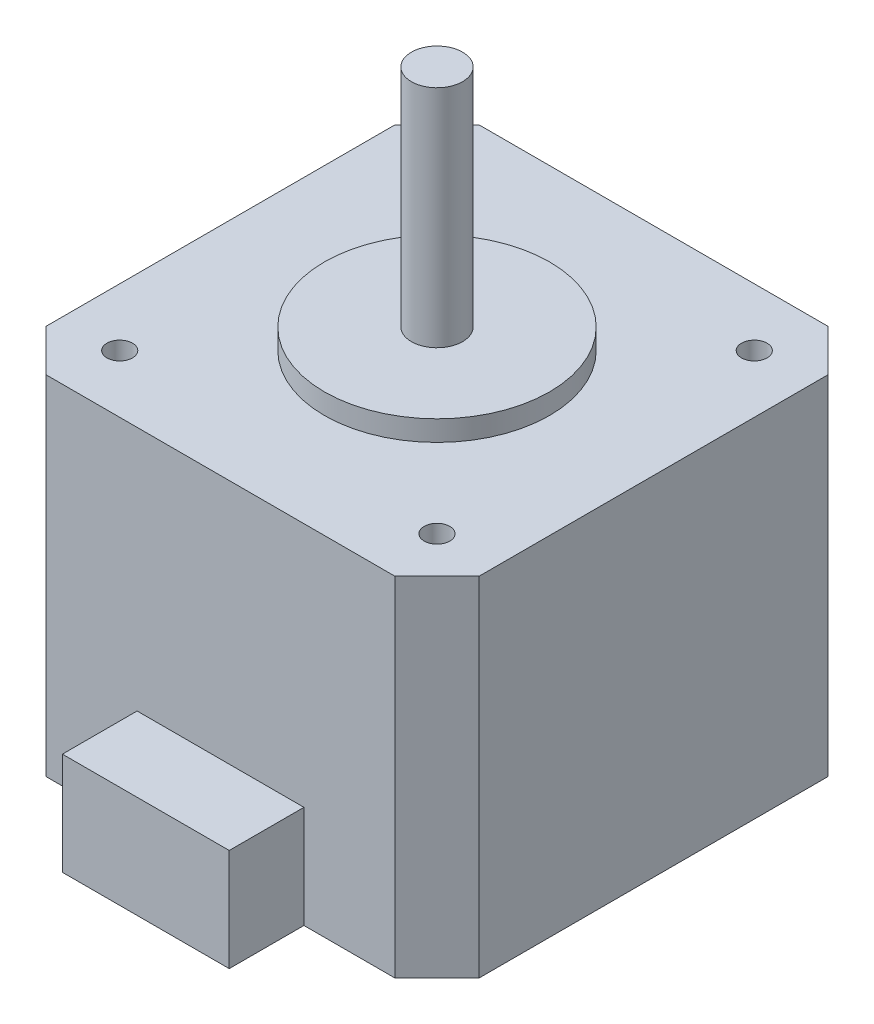
ISO-10303-21;
HEADER;
FILE_DESCRIPTION(('STEP AP214'),'2;1');
FILE_NAME('part.step','',(''),(''),'','','');
FILE_SCHEMA(('AUTOMOTIVE_DESIGN { 1 0 10303 214 1 1 1 1 }'));
ENDSEC;
DATA;
#1=APPLICATION_CONTEXT('core data for automotive mechanical design processes');
#2=APPLICATION_PROTOCOL_DEFINITION('international standard','automotive_design',2000,#1);
#3=PRODUCT_CONTEXT('',#1,'mechanical');
#4=PRODUCT('Part','Part','',(#3));
#5=PRODUCT_RELATED_PRODUCT_CATEGORY('part','',(#4));
#6=PRODUCT_DEFINITION_FORMATION('','',#4);
#7=PRODUCT_DEFINITION_CONTEXT('part definition',#1,'design');
#8=PRODUCT_DEFINITION('design','',#6,#7);
#9=PRODUCT_DEFINITION_SHAPE('','',#8);
#10=(LENGTH_UNIT() NAMED_UNIT(*) SI_UNIT(.MILLI.,.METRE.));
#11=(NAMED_UNIT(*) PLANE_ANGLE_UNIT() SI_UNIT($,.RADIAN.));
#12=(NAMED_UNIT(*) SI_UNIT($,.STERADIAN.) SOLID_ANGLE_UNIT());
#13=UNCERTAINTY_MEASURE_WITH_UNIT(LENGTH_MEASURE(1.E-05),#10,'distance_accuracy_value','');
#14=(GEOMETRIC_REPRESENTATION_CONTEXT(3) GLOBAL_UNCERTAINTY_ASSIGNED_CONTEXT((#13)) GLOBAL_UNIT_ASSIGNED_CONTEXT((#10,
#11,#12)) REPRESENTATION_CONTEXT('',''));
#15=CARTESIAN_POINT('',(0.,0.,0.));
#16=DIRECTION('',(0.,0.,1.));
#17=DIRECTION('',(1.,0.,0.));
#18=AXIS2_PLACEMENT_3D('',#15,#16,#17);
#19=CARTESIAN_POINT('',(-17.0337661840736,34.,21.15));
#20=DIRECTION('',(0.,0.,-1.));
#21=DIRECTION('',(-1.,0.,0.));
#22=AXIS2_PLACEMENT_3D('',#19,#20,#21);
#23=PLANE('',#22);
#24=DIRECTION('',(0.,-1.,0.));
#25=VECTOR('',#24,1.);
#26=CARTESIAN_POINT('',(-8.15,0.,21.15));
#27=LINE('',#26,#25);
#28=CARTESIAN_POINT('',(-8.15,10.,21.15));
#29=VERTEX_POINT('',#28);
#30=CARTESIAN_POINT('',(-8.15,0.,21.15));
#31=VERTEX_POINT('',#30);
#32=EDGE_CURVE('E61',#29,#31,#27,.T.);
#33=ORIENTED_EDGE('',*,*,#32,.F.);
#34=DIRECTION('',(-1.,0.,0.));
#35=VECTOR('',#34,1.);
#36=CARTESIAN_POINT('',(-8.15,10.,21.15));
#37=LINE('',#36,#35);
#38=CARTESIAN_POINT('',(8.15,10.,21.15));
#39=VERTEX_POINT('',#38);
#40=EDGE_CURVE('E166',#39,#29,#37,.T.);
#41=ORIENTED_EDGE('',*,*,#40,.F.);
#42=DIRECTION('',(0.,1.,0.));
#43=VECTOR('',#42,1.);
#44=CARTESIAN_POINT('',(8.14999999999999,0.,21.15));
#45=LINE('',#44,#43);
#46=CARTESIAN_POINT('',(8.14999999999999,0.,21.15));
#47=VERTEX_POINT('',#46);
#48=EDGE_CURVE('E67',#47,#39,#45,.T.);
#49=ORIENTED_EDGE('',*,*,#48,.F.);
#50=DIRECTION('',(1.,0.,0.));
#51=VECTOR('',#50,1.);
#52=CARTESIAN_POINT('',(-17.0337661840736,0.,21.15));
#53=LINE('',#52,#51);
#54=CARTESIAN_POINT('',(17.0337661840736,0.,21.15));
#55=VERTEX_POINT('',#54);
#56=EDGE_CURVE('E226',#47,#55,#53,.T.);
#57=ORIENTED_EDGE('',*,*,#56,.T.);
#58=DIRECTION('',(0.,-1.,0.));
#59=VECTOR('',#58,1.);
#60=CARTESIAN_POINT('',(17.0337661840736,34.,21.15));
#61=LINE('',#60,#59);
#62=CARTESIAN_POINT('',(17.0337661840736,34.,21.15));
#63=VERTEX_POINT('',#62);
#64=EDGE_CURVE('E257',#63,#55,#61,.T.);
#65=ORIENTED_EDGE('',*,*,#64,.F.);
#66=DIRECTION('',(1.,0.,0.));
#67=VECTOR('',#66,1.);
#68=CARTESIAN_POINT('',(-17.0337661840736,34.,21.15));
#69=LINE('',#68,#67);
#70=CARTESIAN_POINT('',(-17.0337661840736,34.,21.15));
#71=VERTEX_POINT('',#70);
#72=EDGE_CURVE('E208',#71,#63,#69,.T.);
#73=ORIENTED_EDGE('',*,*,#72,.F.);
#74=DIRECTION('',(0.,-1.,0.));
#75=VECTOR('',#74,1.);
#76=CARTESIAN_POINT('',(-17.0337661840736,34.,21.15));
#77=LINE('',#76,#75);
#78=CARTESIAN_POINT('',(-17.0337661840736,0.,21.15));
#79=VERTEX_POINT('',#78);
#80=EDGE_CURVE('E53',#71,#79,#77,.T.);
#81=ORIENTED_EDGE('',*,*,#80,.T.);
#82=EDGE_CURVE('E227',#79,#31,#53,.T.);
#83=ORIENTED_EDGE('',*,*,#82,.T.);
#84=EDGE_LOOP('',(#33,#41,#49,#57,#65,#73,#81,#83));
#85=FACE_BOUND('',#84,.T.);
#86=ADVANCED_FACE('F44',(#85),#23,.F.);
#87=CARTESIAN_POINT('',(-21.15,34.,17.0337661840736));
#88=DIRECTION('',(0.707106781186549,0.,-0.707106781186547));
#89=DIRECTION('',(-0.707106781186547,0.,-0.707106781186548));
#90=AXIS2_PLACEMENT_3D('',#87,#88,#89);
#91=PLANE('',#90);
#92=DIRECTION('',(0.707106781186547,0.,0.707106781186548));
#93=VECTOR('',#92,1.);
#94=CARTESIAN_POINT('',(-21.15,0.,17.0337661840736));
#95=LINE('',#94,#93);
#96=CARTESIAN_POINT('',(-21.15,0.,17.0337661840736));
#97=VERTEX_POINT('',#96);
#98=EDGE_CURVE('E203',#97,#79,#95,.T.);
#99=ORIENTED_EDGE('',*,*,#98,.T.);
#100=ORIENTED_EDGE('',*,*,#80,.F.);
#101=DIRECTION('',(0.707106781186547,0.,0.707106781186548));
#102=VECTOR('',#101,1.);
#103=CARTESIAN_POINT('',(-21.15,34.,17.0337661840736));
#104=LINE('',#103,#102);
#105=CARTESIAN_POINT('',(-21.15,34.,17.0337661840736));
#106=VERTEX_POINT('',#105);
#107=EDGE_CURVE('E205',#106,#71,#104,.T.);
#108=ORIENTED_EDGE('',*,*,#107,.F.);
#109=DIRECTION('',(0.,-1.,0.));
#110=VECTOR('',#109,1.);
#111=CARTESIAN_POINT('',(-21.15,34.,17.0337661840736));
#112=LINE('',#111,#110);
#113=EDGE_CURVE('E223',#106,#97,#112,.T.);
#114=ORIENTED_EDGE('',*,*,#113,.T.);
#115=EDGE_LOOP('',(#99,#100,#108,#114));
#116=FACE_BOUND('',#115,.T.);
#117=ADVANCED_FACE('F46',(#116),#91,.F.);
#118=CARTESIAN_POINT('',(17.0337661840736,34.,21.15));
#119=DIRECTION('',(-0.707106781186548,0.,-0.707106781186548));
#120=DIRECTION('',(-0.707106781186548,0.,0.707106781186548));
#121=AXIS2_PLACEMENT_3D('',#118,#119,#120);
#122=PLANE('',#121);
#123=DIRECTION('',(0.707106781186547,0.,-0.707106781186547));
#124=VECTOR('',#123,1.);
#125=CARTESIAN_POINT('',(17.0337661840736,0.,21.15));
#126=LINE('',#125,#124);
#127=CARTESIAN_POINT('',(21.15,0.,17.0337661840736));
#128=VERTEX_POINT('',#127);
#129=EDGE_CURVE('E229',#55,#128,#126,.T.);
#130=ORIENTED_EDGE('',*,*,#129,.T.);
#131=DIRECTION('',(0.,-1.,0.));
#132=VECTOR('',#131,1.);
#133=CARTESIAN_POINT('',(21.15,34.,17.0337661840736));
#134=LINE('',#133,#132);
#135=CARTESIAN_POINT('',(21.15,34.,17.0337661840736));
#136=VERTEX_POINT('',#135);
#137=EDGE_CURVE('E254',#136,#128,#134,.T.);
#138=ORIENTED_EDGE('',*,*,#137,.F.);
#139=DIRECTION('',(0.707106781186547,0.,-0.707106781186547));
#140=VECTOR('',#139,1.);
#141=CARTESIAN_POINT('',(17.0337661840736,34.,21.15));
#142=LINE('',#141,#140);
#143=EDGE_CURVE('E211',#63,#136,#142,.T.);
#144=ORIENTED_EDGE('',*,*,#143,.F.);
#145=ORIENTED_EDGE('',*,*,#64,.T.);
#146=EDGE_LOOP('',(#130,#138,#144,#145));
#147=FACE_BOUND('',#146,.T.);
#148=ADVANCED_FACE('F293',(#147),#122,.F.);
#149=CARTESIAN_POINT('',(21.15,34.,-17.0337661840736));
#150=DIRECTION('',(-1.,0.,0.));
#151=DIRECTION('',(0.,0.,1.));
#152=AXIS2_PLACEMENT_3D('',#149,#150,#151);
#153=PLANE('',#152);
#154=DIRECTION('',(0.,0.,-1.));
#155=VECTOR('',#154,1.);
#156=CARTESIAN_POINT('',(21.15,0.,-17.0337661840736));
#157=LINE('',#156,#155);
#158=CARTESIAN_POINT('',(21.15,0.,-17.0337661840736));
#159=VERTEX_POINT('',#158);
#160=EDGE_CURVE('E231',#128,#159,#157,.T.);
#161=ORIENTED_EDGE('',*,*,#160,.T.);
#162=DIRECTION('',(0.,-1.,0.));
#163=VECTOR('',#162,1.);
#164=CARTESIAN_POINT('',(21.15,34.,-17.0337661840736));
#165=LINE('',#164,#163);
#166=CARTESIAN_POINT('',(21.15,34.,-17.0337661840736));
#167=VERTEX_POINT('',#166);
#168=EDGE_CURVE('E251',#167,#159,#165,.T.);
#169=ORIENTED_EDGE('',*,*,#168,.F.);
#170=DIRECTION('',(0.,0.,-1.));
#171=VECTOR('',#170,1.);
#172=CARTESIAN_POINT('',(21.15,34.,-17.0337661840736));
#173=LINE('',#172,#171);
#174=EDGE_CURVE('E213',#136,#167,#173,.T.);
#175=ORIENTED_EDGE('',*,*,#174,.F.);
#176=ORIENTED_EDGE('',*,*,#137,.T.);
#177=EDGE_LOOP('',(#161,#169,#175,#176));
#178=FACE_BOUND('',#177,.T.);
#179=ADVANCED_FACE('F289',(#178),#153,.F.);
#180=CARTESIAN_POINT('',(17.0337661840736,34.,-21.15));
#181=DIRECTION('',(-0.707106781186547,0.,0.707106781186547));
#182=DIRECTION('',(0.707106781186548,0.,0.707106781186548));
#183=AXIS2_PLACEMENT_3D('',#180,#181,#182);
#184=PLANE('',#183);
#185=DIRECTION('',(-0.707106781186548,0.,-0.707106781186548));
#186=VECTOR('',#185,1.);
#187=CARTESIAN_POINT('',(17.0337661840736,0.,-21.15));
#188=LINE('',#187,#186);
#189=CARTESIAN_POINT('',(17.0337661840736,0.,-21.15));
#190=VERTEX_POINT('',#189);
#191=EDGE_CURVE('E233',#159,#190,#188,.T.);
#192=ORIENTED_EDGE('',*,*,#191,.T.);
#193=DIRECTION('',(0.,-1.,0.));
#194=VECTOR('',#193,1.);
#195=CARTESIAN_POINT('',(17.0337661840736,34.,-21.15));
#196=LINE('',#195,#194);
#197=CARTESIAN_POINT('',(17.0337661840736,34.,-21.15));
#198=VERTEX_POINT('',#197);
#199=EDGE_CURVE('E248',#198,#190,#196,.T.);
#200=ORIENTED_EDGE('',*,*,#199,.F.);
#201=DIRECTION('',(-0.707106781186548,0.,-0.707106781186548));
#202=VECTOR('',#201,1.);
#203=CARTESIAN_POINT('',(17.0337661840736,34.,-21.15));
#204=LINE('',#203,#202);
#205=EDGE_CURVE('E215',#167,#198,#204,.T.);
#206=ORIENTED_EDGE('',*,*,#205,.F.);
#207=ORIENTED_EDGE('',*,*,#168,.T.);
#208=EDGE_LOOP('',(#192,#200,#206,#207));
#209=FACE_BOUND('',#208,.T.);
#210=ADVANCED_FACE('F284',(#209),#184,.F.);
#211=CARTESIAN_POINT('',(-17.0337661840736,34.,-21.15));
#212=DIRECTION('',(0.,0.,1.));
#213=DIRECTION('',(1.,0.,0.));
#214=AXIS2_PLACEMENT_3D('',#211,#212,#213);
#215=PLANE('',#214);
#216=DIRECTION('',(-1.,0.,0.));
#217=VECTOR('',#216,1.);
#218=CARTESIAN_POINT('',(-17.0337661840736,0.,-21.15));
#219=LINE('',#218,#217);
#220=CARTESIAN_POINT('',(-17.0337661840736,0.,-21.15));
#221=VERTEX_POINT('',#220);
#222=EDGE_CURVE('E235',#190,#221,#219,.T.);
#223=ORIENTED_EDGE('',*,*,#222,.T.);
#224=DIRECTION('',(0.,-1.,0.));
#225=VECTOR('',#224,1.);
#226=CARTESIAN_POINT('',(-17.0337661840736,34.,-21.15));
#227=LINE('',#226,#225);
#228=CARTESIAN_POINT('',(-17.0337661840736,34.,-21.15));
#229=VERTEX_POINT('',#228);
#230=EDGE_CURVE('E245',#229,#221,#227,.T.);
#231=ORIENTED_EDGE('',*,*,#230,.F.);
#232=DIRECTION('',(-1.,0.,0.));
#233=VECTOR('',#232,1.);
#234=CARTESIAN_POINT('',(-17.0337661840736,34.,-21.15));
#235=LINE('',#234,#233);
#236=EDGE_CURVE('E217',#198,#229,#235,.T.);
#237=ORIENTED_EDGE('',*,*,#236,.F.);
#238=ORIENTED_EDGE('',*,*,#199,.T.);
#239=EDGE_LOOP('',(#223,#231,#237,#238));
#240=FACE_BOUND('',#239,.T.);
#241=ADVANCED_FACE('F278',(#240),#215,.F.);
#242=CARTESIAN_POINT('',(-21.15,34.,-17.0337661840736));
#243=DIRECTION('',(0.707106781186547,0.,0.707106781186548));
#244=DIRECTION('',(0.707106781186548,0.,-0.707106781186547));
#245=AXIS2_PLACEMENT_3D('',#242,#243,#244);
#246=PLANE('',#245);
#247=DIRECTION('',(-0.707106781186548,0.,0.707106781186547));
#248=VECTOR('',#247,1.);
#249=CARTESIAN_POINT('',(-21.15,0.,-17.0337661840736));
#250=LINE('',#249,#248);
#251=CARTESIAN_POINT('',(-21.15,0.,-17.0337661840736));
#252=VERTEX_POINT('',#251);
#253=EDGE_CURVE('E237',#221,#252,#250,.T.);
#254=ORIENTED_EDGE('',*,*,#253,.T.);
#255=DIRECTION('',(0.,-1.,0.));
#256=VECTOR('',#255,1.);
#257=CARTESIAN_POINT('',(-21.15,34.,-17.0337661840736));
#258=LINE('',#257,#256);
#259=CARTESIAN_POINT('',(-21.15,34.,-17.0337661840736));
#260=VERTEX_POINT('',#259);
#261=EDGE_CURVE('E242',#260,#252,#258,.T.);
#262=ORIENTED_EDGE('',*,*,#261,.F.);
#263=DIRECTION('',(-0.707106781186548,0.,0.707106781186547));
#264=VECTOR('',#263,1.);
#265=CARTESIAN_POINT('',(-21.15,34.,-17.0337661840736));
#266=LINE('',#265,#264);
#267=EDGE_CURVE('E219',#229,#260,#266,.T.);
#268=ORIENTED_EDGE('',*,*,#267,.F.);
#269=ORIENTED_EDGE('',*,*,#230,.T.);
#270=EDGE_LOOP('',(#254,#262,#268,#269));
#271=FACE_BOUND('',#270,.T.);
#272=ADVANCED_FACE('F274',(#271),#246,.F.);
#273=CARTESIAN_POINT('',(-21.15,34.,-17.0337661840736));
#274=DIRECTION('',(1.,0.,0.));
#275=DIRECTION('',(0.,0.,-1.));
#276=AXIS2_PLACEMENT_3D('',#273,#274,#275);
#277=PLANE('',#276);
#278=DIRECTION('',(0.,0.,1.));
#279=VECTOR('',#278,1.);
#280=CARTESIAN_POINT('',(-21.15,0.,-17.0337661840736));
#281=LINE('',#280,#279);
#282=EDGE_CURVE('E209',#252,#97,#281,.T.);
#283=ORIENTED_EDGE('',*,*,#282,.T.);
#284=ORIENTED_EDGE('',*,*,#113,.F.);
#285=DIRECTION('',(0.,0.,1.));
#286=VECTOR('',#285,1.);
#287=CARTESIAN_POINT('',(-21.15,34.,-17.0337661840736));
#288=LINE('',#287,#286);
#289=EDGE_CURVE('E221',#260,#106,#288,.T.);
#290=ORIENTED_EDGE('',*,*,#289,.F.);
#291=ORIENTED_EDGE('',*,*,#261,.T.);
#292=EDGE_LOOP('',(#283,#284,#290,#291));
#293=FACE_BOUND('',#292,.T.);
#294=ADVANCED_FACE('F269',(#293),#277,.F.);
#295=CARTESIAN_POINT('',(0.,34.,0.));
#296=DIRECTION('',(0.,1.,0.));
#297=DIRECTION('',(0.,0.,1.));
#298=AXIS2_PLACEMENT_3D('',#295,#296,#297);
#299=PLANE('',#298);
#300=CARTESIAN_POINT('',(-15.5,34.,-15.5));
#301=DIRECTION('',(0.,1.,0.));
#302=DIRECTION('',(0.,0.,1.));
#303=AXIS2_PLACEMENT_3D('',#300,#301,#302);
#304=CIRCLE('',#303,1.24999999999999);
#305=CARTESIAN_POINT('',(-15.5,34.,-14.25));
#306=VERTEX_POINT('',#305);
#307=EDGE_CURVE('E169',#306,#306,#304,.T.);
#308=ORIENTED_EDGE('',*,*,#307,.F.);
#309=EDGE_LOOP('',(#308));
#310=FACE_BOUND('',#309,.T.);
#311=CARTESIAN_POINT('',(15.5,34.,15.5));
#312=DIRECTION('',(0.,1.,0.));
#313=DIRECTION('',(0.,0.,1.));
#314=AXIS2_PLACEMENT_3D('',#311,#312,#313);
#315=CIRCLE('',#314,1.24999999999999);
#316=CARTESIAN_POINT('',(15.5,34.,16.75));
#317=VERTEX_POINT('',#316);
#318=EDGE_CURVE('E180',#317,#317,#315,.T.);
#319=ORIENTED_EDGE('',*,*,#318,.F.);
#320=EDGE_LOOP('',(#319));
#321=FACE_BOUND('',#320,.T.);
#322=CARTESIAN_POINT('',(-15.5,34.,15.5));
#323=DIRECTION('',(0.,1.,0.));
#324=DIRECTION('',(0.,0.,1.));
#325=AXIS2_PLACEMENT_3D('',#322,#323,#324);
#326=CIRCLE('',#325,1.24999999999999);
#327=CARTESIAN_POINT('',(-15.5,34.,16.75));
#328=VERTEX_POINT('',#327);
#329=EDGE_CURVE('E186',#328,#328,#326,.T.);
#330=ORIENTED_EDGE('',*,*,#329,.F.);
#331=EDGE_LOOP('',(#330));
#332=FACE_BOUND('',#331,.T.);
#333=CARTESIAN_POINT('',(15.5,34.,-15.5));
#334=DIRECTION('',(0.,1.,0.));
#335=DIRECTION('',(0.,0.,1.));
#336=AXIS2_PLACEMENT_3D('',#333,#334,#335);
#337=CIRCLE('',#336,1.24999999999999);
#338=CARTESIAN_POINT('',(15.5,34.,-14.25));
#339=VERTEX_POINT('',#338);
#340=EDGE_CURVE('E192',#339,#339,#337,.T.);
#341=ORIENTED_EDGE('',*,*,#340,.F.);
#342=EDGE_LOOP('',(#341));
#343=FACE_BOUND('',#342,.T.);
#344=CARTESIAN_POINT('',(0.,34.,0.));
#345=DIRECTION('',(0.,1.,0.));
#346=DIRECTION('',(0.,0.,1.));
#347=AXIS2_PLACEMENT_3D('',#344,#345,#346);
#348=CIRCLE('',#347,11.);
#349=CARTESIAN_POINT('',(0.,34.,11.));
#350=VERTEX_POINT('',#349);
#351=EDGE_CURVE('E11',#350,#350,#348,.T.);
#352=ORIENTED_EDGE('',*,*,#351,.F.);
#353=EDGE_LOOP('',(#352));
#354=FACE_BOUND('',#353,.T.);
#355=ORIENTED_EDGE('',*,*,#107,.T.);
#356=ORIENTED_EDGE('',*,*,#72,.T.);
#357=ORIENTED_EDGE('',*,*,#143,.T.);
#358=ORIENTED_EDGE('',*,*,#174,.T.);
#359=ORIENTED_EDGE('',*,*,#205,.T.);
#360=ORIENTED_EDGE('',*,*,#236,.T.);
#361=ORIENTED_EDGE('',*,*,#267,.T.);
#362=ORIENTED_EDGE('',*,*,#289,.T.);
#363=EDGE_LOOP('',(#355,#356,#357,#358,#359,#360,#361,#362));
#364=FACE_BOUND('',#363,.T.);
#365=ADVANCED_FACE('F332',(#310,#321,#332,#343,#354,#364),#299,.T.);
#366=CARTESIAN_POINT('',(0.,0.,0.));
#367=DIRECTION('',(0.,1.,0.));
#368=DIRECTION('',(0.,0.,1.));
#369=AXIS2_PLACEMENT_3D('',#366,#367,#368);
#370=PLANE('',#369);
#371=ORIENTED_EDGE('',*,*,#98,.F.);
#372=ORIENTED_EDGE('',*,*,#282,.F.);
#373=ORIENTED_EDGE('',*,*,#253,.F.);
#374=ORIENTED_EDGE('',*,*,#222,.F.);
#375=ORIENTED_EDGE('',*,*,#191,.F.);
#376=ORIENTED_EDGE('',*,*,#160,.F.);
#377=ORIENTED_EDGE('',*,*,#129,.F.);
#378=ORIENTED_EDGE('',*,*,#56,.F.);
#379=DIRECTION('',(0.,0.,-1.));
#380=VECTOR('',#379,1.);
#381=CARTESIAN_POINT('',(8.14999999999999,0.,28.45));
#382=LINE('',#381,#380);
#383=CARTESIAN_POINT('',(8.14999999999999,0.,28.45));
#384=VERTEX_POINT('',#383);
#385=EDGE_CURVE('E153',#384,#47,#382,.T.);
#386=ORIENTED_EDGE('',*,*,#385,.F.);
#387=DIRECTION('',(1.,0.,0.));
#388=VECTOR('',#387,1.);
#389=CARTESIAN_POINT('',(-8.15,0.,28.45));
#390=LINE('',#389,#388);
#391=CARTESIAN_POINT('',(-8.15,0.,28.45));
#392=VERTEX_POINT('',#391);
#393=EDGE_CURVE('E146',#392,#384,#390,.T.);
#394=ORIENTED_EDGE('',*,*,#393,.F.);
#395=DIRECTION('',(0.,0.,-1.));
#396=VECTOR('',#395,1.);
#397=CARTESIAN_POINT('',(-8.15,0.,28.45));
#398=LINE('',#397,#396);
#399=EDGE_CURVE('E151',#392,#31,#398,.T.);
#400=ORIENTED_EDGE('',*,*,#399,.T.);
#401=ORIENTED_EDGE('',*,*,#82,.F.);
#402=EDGE_LOOP('',(#371,#372,#373,#374,#375,#376,#377,#378,#386,#394,#400,#401));
#403=FACE_BOUND('',#402,.T.);
#404=ADVANCED_FACE('F149',(#403),#370,.F.);
#405=CARTESIAN_POINT('',(0.,36.,0.));
#406=DIRECTION('',(0.,-1.,0.));
#407=DIRECTION('',(0.,0.,-1.));
#408=AXIS2_PLACEMENT_3D('',#405,#406,#407);
#409=CYLINDRICAL_SURFACE('',#408,11.);
#410=CARTESIAN_POINT('',(0.,36.,0.));
#411=DIRECTION('',(0.,1.,0.));
#412=DIRECTION('',(0.,0.,1.));
#413=AXIS2_PLACEMENT_3D('',#410,#411,#412);
#414=CIRCLE('',#413,11.);
#415=CARTESIAN_POINT('',(0.,36.,11.));
#416=VERTEX_POINT('',#415);
#417=EDGE_CURVE('E201',#416,#416,#414,.T.);
#418=ORIENTED_EDGE('',*,*,#417,.F.);
#419=EDGE_LOOP('',(#418));
#420=FACE_BOUND('',#419,.T.);
#421=ORIENTED_EDGE('',*,*,#351,.T.);
#422=EDGE_LOOP('',(#421));
#423=FACE_BOUND('',#422,.T.);
#424=ADVANCED_FACE('F335',(#420,#423),#409,.T.);
#425=CARTESIAN_POINT('',(0.,36.,0.));
#426=DIRECTION('',(0.,1.,0.));
#427=DIRECTION('',(0.,0.,1.));
#428=AXIS2_PLACEMENT_3D('',#425,#426,#427);
#429=PLANE('',#428);
#430=CARTESIAN_POINT('',(0.,36.,0.));
#431=DIRECTION('',(0.,1.,0.));
#432=DIRECTION('',(0.,0.,1.));
#433=AXIS2_PLACEMENT_3D('',#430,#431,#432);
#434=CIRCLE('',#433,2.5);
#435=CARTESIAN_POINT('',(0.,36.,2.5));
#436=VERTEX_POINT('',#435);
#437=EDGE_CURVE('E48',#436,#436,#434,.F.);
#438=ORIENTED_EDGE('',*,*,#437,.T.);
#439=EDGE_LOOP('',(#438));
#440=FACE_BOUND('',#439,.T.);
#441=ORIENTED_EDGE('',*,*,#417,.T.);
#442=EDGE_LOOP('',(#441));
#443=FACE_BOUND('',#442,.T.);
#444=ADVANCED_FACE('F341',(#440,#443),#429,.T.);
#445=CARTESIAN_POINT('',(0.,58.,0.));
#446=DIRECTION('',(0.,-1.,0.));
#447=DIRECTION('',(0.,0.,-1.));
#448=AXIS2_PLACEMENT_3D('',#445,#446,#447);
#449=CYLINDRICAL_SURFACE('',#448,2.5);
#450=ORIENTED_EDGE('',*,*,#437,.F.);
#451=EDGE_LOOP('',(#450));
#452=FACE_BOUND('',#451,.T.);
#453=CARTESIAN_POINT('',(0.,58.,0.));
#454=DIRECTION('',(0.,1.,0.));
#455=DIRECTION('',(0.,0.,1.));
#456=AXIS2_PLACEMENT_3D('',#453,#454,#455);
#457=CIRCLE('',#456,2.5);
#458=CARTESIAN_POINT('',(0.,58.,2.5));
#459=VERTEX_POINT('',#458);
#460=EDGE_CURVE('E198',#459,#459,#457,.T.);
#461=ORIENTED_EDGE('',*,*,#460,.F.);
#462=EDGE_LOOP('',(#461));
#463=FACE_BOUND('',#462,.T.);
#464=ADVANCED_FACE('F345',(#452,#463),#449,.T.);
#465=CARTESIAN_POINT('',(0.,58.,0.));
#466=DIRECTION('',(0.,1.,0.));
#467=DIRECTION('',(0.,0.,1.));
#468=AXIS2_PLACEMENT_3D('',#465,#466,#467);
#469=PLANE('',#468);
#470=ORIENTED_EDGE('',*,*,#460,.T.);
#471=EDGE_LOOP('',(#470));
#472=FACE_BOUND('',#471,.T.);
#473=ADVANCED_FACE('F349',(#472),#469,.T.);
#474=CARTESIAN_POINT('',(15.5,29.5,-15.5));
#475=DIRECTION('',(0.,1.,0.));
#476=DIRECTION('',(0.,0.,1.));
#477=AXIS2_PLACEMENT_3D('',#474,#475,#476);
#478=CONICAL_SURFACE('',#477,1.25,1.02974425867665);
#479=CARTESIAN_POINT('',(15.5,28.7489242262156,-15.5));
#480=VERTEX_POINT('',#479);
#481=VERTEX_LOOP('',#480);
#482=FACE_BOUND('',#481,.T.);
#483=CARTESIAN_POINT('',(15.5,29.5,-15.5));
#484=DIRECTION('',(0.,1.,0.));
#485=DIRECTION('',(0.,0.,1.));
#486=AXIS2_PLACEMENT_3D('',#483,#484,#485);
#487=CIRCLE('',#486,1.25);
#488=CARTESIAN_POINT('',(15.5,29.5,-14.25));
#489=VERTEX_POINT('',#488);
#490=EDGE_CURVE('E195',#489,#489,#487,.T.);
#491=ORIENTED_EDGE('',*,*,#490,.T.);
#492=EDGE_LOOP('',(#491));
#493=FACE_BOUND('',#492,.T.);
#494=ADVANCED_FACE('F353',(#482,#493),#478,.F.);
#495=CARTESIAN_POINT('',(15.5,34.,-15.5));
#496=DIRECTION('',(0.,1.,0.));
#497=DIRECTION('',(0.,0.,1.));
#498=AXIS2_PLACEMENT_3D('',#495,#496,#497);
#499=CYLINDRICAL_SURFACE('',#498,1.24999999999999);
#500=ORIENTED_EDGE('',*,*,#490,.F.);
#501=EDGE_LOOP('',(#500));
#502=FACE_BOUND('',#501,.T.);
#503=ORIENTED_EDGE('',*,*,#340,.T.);
#504=EDGE_LOOP('',(#503));
#505=FACE_BOUND('',#504,.T.);
#506=ADVANCED_FACE('F357',(#502,#505),#499,.F.);
#507=CARTESIAN_POINT('',(-15.5,29.5,15.5));
#508=DIRECTION('',(0.,1.,0.));
#509=DIRECTION('',(0.,0.,1.));
#510=AXIS2_PLACEMENT_3D('',#507,#508,#509);
#511=CONICAL_SURFACE('',#510,1.25,1.02974425867665);
#512=CARTESIAN_POINT('',(-15.5,28.7489242262156,15.5));
#513=VERTEX_POINT('',#512);
#514=VERTEX_LOOP('',#513);
#515=FACE_BOUND('',#514,.T.);
#516=CARTESIAN_POINT('',(-15.5,29.5,15.5));
#517=DIRECTION('',(0.,1.,0.));
#518=DIRECTION('',(0.,0.,1.));
#519=AXIS2_PLACEMENT_3D('',#516,#517,#518);
#520=CIRCLE('',#519,1.25);
#521=CARTESIAN_POINT('',(-15.5,29.5,16.75));
#522=VERTEX_POINT('',#521);
#523=EDGE_CURVE('E189',#522,#522,#520,.T.);
#524=ORIENTED_EDGE('',*,*,#523,.T.);
#525=EDGE_LOOP('',(#524));
#526=FACE_BOUND('',#525,.T.);
#527=ADVANCED_FACE('F361',(#515,#526),#511,.F.);
#528=CARTESIAN_POINT('',(-15.5,34.,15.5));
#529=DIRECTION('',(0.,1.,0.));
#530=DIRECTION('',(0.,0.,1.));
#531=AXIS2_PLACEMENT_3D('',#528,#529,#530);
#532=CYLINDRICAL_SURFACE('',#531,1.24999999999999);
#533=ORIENTED_EDGE('',*,*,#523,.F.);
#534=EDGE_LOOP('',(#533));
#535=FACE_BOUND('',#534,.T.);
#536=ORIENTED_EDGE('',*,*,#329,.T.);
#537=EDGE_LOOP('',(#536));
#538=FACE_BOUND('',#537,.T.);
#539=ADVANCED_FACE('F365',(#535,#538),#532,.F.);
#540=CARTESIAN_POINT('',(15.5,29.5,15.5));
#541=DIRECTION('',(0.,1.,0.));
#542=DIRECTION('',(0.,0.,1.));
#543=AXIS2_PLACEMENT_3D('',#540,#541,#542);
#544=CONICAL_SURFACE('',#543,1.25,1.02974425867665);
#545=CARTESIAN_POINT('',(15.5,28.7489242262156,15.5));
#546=VERTEX_POINT('',#545);
#547=VERTEX_LOOP('',#546);
#548=FACE_BOUND('',#547,.T.);
#549=CARTESIAN_POINT('',(15.5,29.5,15.5));
#550=DIRECTION('',(0.,1.,0.));
#551=DIRECTION('',(0.,0.,1.));
#552=AXIS2_PLACEMENT_3D('',#549,#550,#551);
#553=CIRCLE('',#552,1.25);
#554=CARTESIAN_POINT('',(15.5,29.5,16.75));
#555=VERTEX_POINT('',#554);
#556=EDGE_CURVE('E183',#555,#555,#553,.T.);
#557=ORIENTED_EDGE('',*,*,#556,.T.);
#558=EDGE_LOOP('',(#557));
#559=FACE_BOUND('',#558,.T.);
#560=ADVANCED_FACE('F369',(#548,#559),#544,.F.);
#561=CARTESIAN_POINT('',(15.5,34.,15.5));
#562=DIRECTION('',(0.,1.,0.));
#563=DIRECTION('',(0.,0.,1.));
#564=AXIS2_PLACEMENT_3D('',#561,#562,#563);
#565=CYLINDRICAL_SURFACE('',#564,1.24999999999999);
#566=ORIENTED_EDGE('',*,*,#556,.F.);
#567=EDGE_LOOP('',(#566));
#568=FACE_BOUND('',#567,.T.);
#569=ORIENTED_EDGE('',*,*,#318,.T.);
#570=EDGE_LOOP('',(#569));
#571=FACE_BOUND('',#570,.T.);
#572=ADVANCED_FACE('F373',(#568,#571),#565,.F.);
#573=CARTESIAN_POINT('',(-15.5,29.5,-15.5));
#574=DIRECTION('',(0.,1.,0.));
#575=DIRECTION('',(0.,0.,1.));
#576=AXIS2_PLACEMENT_3D('',#573,#574,#575);
#577=CONICAL_SURFACE('',#576,1.25,1.02974425867665);
#578=CARTESIAN_POINT('',(-15.5,28.7489242262156,-15.5));
#579=VERTEX_POINT('',#578);
#580=VERTEX_LOOP('',#579);
#581=FACE_BOUND('',#580,.T.);
#582=CARTESIAN_POINT('',(-15.5,29.5,-15.5));
#583=DIRECTION('',(0.,1.,0.));
#584=DIRECTION('',(0.,0.,1.));
#585=AXIS2_PLACEMENT_3D('',#582,#583,#584);
#586=CIRCLE('',#585,1.25);
#587=CARTESIAN_POINT('',(-15.5,29.5,-14.25));
#588=VERTEX_POINT('',#587);
#589=EDGE_CURVE('E172',#588,#588,#586,.T.);
#590=ORIENTED_EDGE('',*,*,#589,.T.);
#591=EDGE_LOOP('',(#590));
#592=FACE_BOUND('',#591,.T.);
#593=ADVANCED_FACE('F377',(#581,#592),#577,.F.);
#594=CARTESIAN_POINT('',(-15.5,34.,-15.5));
#595=DIRECTION('',(0.,1.,0.));
#596=DIRECTION('',(0.,0.,1.));
#597=AXIS2_PLACEMENT_3D('',#594,#595,#596);
#598=CYLINDRICAL_SURFACE('',#597,1.24999999999999);
#599=ORIENTED_EDGE('',*,*,#589,.F.);
#600=EDGE_LOOP('',(#599));
#601=FACE_BOUND('',#600,.T.);
#602=ORIENTED_EDGE('',*,*,#307,.T.);
#603=EDGE_LOOP('',(#602));
#604=FACE_BOUND('',#603,.T.);
#605=ADVANCED_FACE('F381',(#601,#604),#598,.F.);
#606=CARTESIAN_POINT('',(-8.15,0.,28.45));
#607=DIRECTION('',(1.,0.,0.));
#608=DIRECTION('',(0.,1.,0.));
#609=AXIS2_PLACEMENT_3D('',#606,#607,#608);
#610=PLANE('',#609);
#611=ORIENTED_EDGE('',*,*,#32,.T.);
#612=ORIENTED_EDGE('',*,*,#399,.F.);
#613=DIRECTION('',(0.,-1.,0.));
#614=VECTOR('',#613,1.);
#615=CARTESIAN_POINT('',(-8.15,0.,28.45));
#616=LINE('',#615,#614);
#617=CARTESIAN_POINT('',(-8.15,10.,28.45));
#618=VERTEX_POINT('',#617);
#619=EDGE_CURVE('E157',#618,#392,#616,.T.);
#620=ORIENTED_EDGE('',*,*,#619,.F.);
#621=DIRECTION('',(0.,0.,-1.));
#622=VECTOR('',#621,1.);
#623=CARTESIAN_POINT('',(-8.15,10.,28.45));
#624=LINE('',#623,#622);
#625=EDGE_CURVE('E299',#618,#29,#624,.T.);
#626=ORIENTED_EDGE('',*,*,#625,.T.);
#627=EDGE_LOOP('',(#611,#612,#620,#626));
#628=FACE_BOUND('',#627,.T.);
#629=ADVANCED_FACE('F168',(#628),#610,.F.);
#630=CARTESIAN_POINT('',(8.14999999999999,0.,28.45));
#631=DIRECTION('',(-1.,0.,0.));
#632=DIRECTION('',(0.,-1.,0.));
#633=AXIS2_PLACEMENT_3D('',#630,#631,#632);
#634=PLANE('',#633);
#635=ORIENTED_EDGE('',*,*,#48,.T.);
#636=DIRECTION('',(0.,0.,-1.));
#637=VECTOR('',#636,1.);
#638=CARTESIAN_POINT('',(8.15,10.,28.45));
#639=LINE('',#638,#637);
#640=CARTESIAN_POINT('',(8.15,10.,28.45));
#641=VERTEX_POINT('',#640);
#642=EDGE_CURVE('E174',#641,#39,#639,.T.);
#643=ORIENTED_EDGE('',*,*,#642,.F.);
#644=DIRECTION('',(0.,1.,0.));
#645=VECTOR('',#644,1.);
#646=CARTESIAN_POINT('',(8.14999999999999,0.,28.45));
#647=LINE('',#646,#645);
#648=EDGE_CURVE('E156',#384,#641,#647,.T.);
#649=ORIENTED_EDGE('',*,*,#648,.F.);
#650=ORIENTED_EDGE('',*,*,#385,.T.);
#651=EDGE_LOOP('',(#635,#643,#649,#650));
#652=FACE_BOUND('',#651,.T.);
#653=ADVANCED_FACE('F295',(#652),#634,.F.);
#654=CARTESIAN_POINT('',(-8.15,10.,28.45));
#655=DIRECTION('',(0.,-1.,0.));
#656=DIRECTION('',(0.,0.,-1.));
#657=AXIS2_PLACEMENT_3D('',#654,#655,#656);
#658=PLANE('',#657);
#659=ORIENTED_EDGE('',*,*,#40,.T.);
#660=ORIENTED_EDGE('',*,*,#625,.F.);
#661=DIRECTION('',(-1.,0.,0.));
#662=VECTOR('',#661,1.);
#663=CARTESIAN_POINT('',(-8.15,10.,28.45));
#664=LINE('',#663,#662);
#665=EDGE_CURVE('E162',#641,#618,#664,.T.);
#666=ORIENTED_EDGE('',*,*,#665,.F.);
#667=ORIENTED_EDGE('',*,*,#642,.T.);
#668=EDGE_LOOP('',(#659,#660,#666,#667));
#669=FACE_BOUND('',#668,.T.);
#670=ADVANCED_FACE('F306',(#669),#658,.F.);
#671=CARTESIAN_POINT('',(0.,0.,28.45));
#672=DIRECTION('',(0.,0.,-1.));
#673=DIRECTION('',(-1.,0.,0.));
#674=AXIS2_PLACEMENT_3D('',#671,#672,#673);
#675=PLANE('',#674);
#676=ORIENTED_EDGE('',*,*,#619,.T.);
#677=ORIENTED_EDGE('',*,*,#393,.T.);
#678=ORIENTED_EDGE('',*,*,#648,.T.);
#679=ORIENTED_EDGE('',*,*,#665,.T.);
#680=EDGE_LOOP('',(#676,#677,#678,#679));
#681=FACE_BOUND('',#680,.T.);
#682=ADVANCED_FACE('F160',(#681),#675,.F.);
#683=CLOSED_SHELL('',(#86,#117,#148,#179,#210,#241,#272,#294,#365,#404,#424,#444,#464,#473,#494,
#506,#527,#539,#560,#572,#593,#605,#629,#653,#670,#682));
#684=MANIFOLD_SOLID_BREP('B2',#683);
#685=ADVANCED_BREP_SHAPE_REPRESENTATION('',(#18,#684),#14);
#686=SHAPE_DEFINITION_REPRESENTATION(#9,#685);
ENDSEC;
END-ISO-10303-21;
